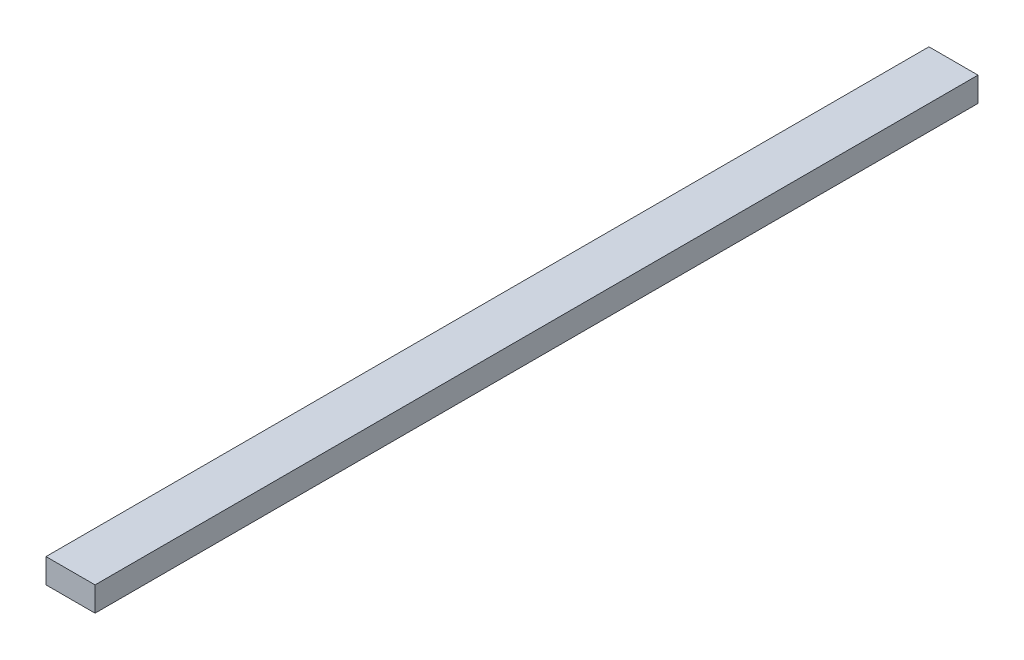
ISO-10303-21;
HEADER;
FILE_DESCRIPTION(('STEP AP214'),'2;1');
FILE_NAME('part.step','',(''),(''),'','','');
FILE_SCHEMA(('AUTOMOTIVE_DESIGN { 1 0 10303 214 1 1 1 1 }'));
ENDSEC;
DATA;
#1=APPLICATION_CONTEXT('core data for automotive mechanical design processes');
#2=APPLICATION_PROTOCOL_DEFINITION('international standard','automotive_design',2000,#1);
#3=PRODUCT_CONTEXT('',#1,'mechanical');
#4=PRODUCT('Part','Part','',(#3));
#5=PRODUCT_RELATED_PRODUCT_CATEGORY('part','',(#4));
#6=PRODUCT_DEFINITION_FORMATION('','',#4);
#7=PRODUCT_DEFINITION_CONTEXT('part definition',#1,'design');
#8=PRODUCT_DEFINITION('design','',#6,#7);
#9=PRODUCT_DEFINITION_SHAPE('','',#8);
#10=(LENGTH_UNIT() NAMED_UNIT(*) SI_UNIT(.MILLI.,.METRE.));
#11=(NAMED_UNIT(*) PLANE_ANGLE_UNIT() SI_UNIT($,.RADIAN.));
#12=(NAMED_UNIT(*) SI_UNIT($,.STERADIAN.) SOLID_ANGLE_UNIT());
#13=UNCERTAINTY_MEASURE_WITH_UNIT(LENGTH_MEASURE(1.E-05),#10,'distance_accuracy_value','');
#14=(GEOMETRIC_REPRESENTATION_CONTEXT(3) GLOBAL_UNCERTAINTY_ASSIGNED_CONTEXT((#13)) GLOBAL_UNIT_ASSIGNED_CONTEXT((#10,
#11,#12)) REPRESENTATION_CONTEXT('',''));
#15=CARTESIAN_POINT('',(0.,0.,0.));
#16=DIRECTION('',(0.,0.,1.));
#17=DIRECTION('',(1.,0.,0.));
#18=AXIS2_PLACEMENT_3D('',#15,#16,#17);
#19=CARTESIAN_POINT('',(0.,0.,1828.8));
#20=DIRECTION('',(1.,0.,0.));
#21=DIRECTION('',(0.,0.,-1.));
#22=AXIS2_PLACEMENT_3D('',#19,#20,#21);
#23=PLANE('',#22);
#24=DIRECTION('',(0.,-1.,0.));
#25=VECTOR('',#24,1.);
#26=CARTESIAN_POINT('',(0.,0.,0.));
#27=LINE('',#26,#25);
#28=CARTESIAN_POINT('',(0.,50.8,0.));
#29=VERTEX_POINT('',#28);
#30=CARTESIAN_POINT('',(0.,0.,0.));
#31=VERTEX_POINT('',#30);
#32=EDGE_CURVE('E95',#29,#31,#27,.T.);
#33=ORIENTED_EDGE('',*,*,#32,.T.);
#34=DIRECTION('',(0.,0.,-1.));
#35=VECTOR('',#34,1.);
#36=CARTESIAN_POINT('',(0.,0.,1828.8));
#37=LINE('',#36,#35);
#38=CARTESIAN_POINT('',(0.,0.,1828.8));
#39=VERTEX_POINT('',#38);
#40=EDGE_CURVE('E11',#39,#31,#37,.T.);
#41=ORIENTED_EDGE('',*,*,#40,.F.);
#42=DIRECTION('',(0.,-1.,0.));
#43=VECTOR('',#42,1.);
#44=CARTESIAN_POINT('',(0.,0.,1828.8));
#45=LINE('',#44,#43);
#46=CARTESIAN_POINT('',(0.,50.8,1828.8));
#47=VERTEX_POINT('',#46);
#48=EDGE_CURVE('E83',#47,#39,#45,.T.);
#49=ORIENTED_EDGE('',*,*,#48,.F.);
#50=DIRECTION('',(0.,0.,-1.));
#51=VECTOR('',#50,1.);
#52=CARTESIAN_POINT('',(0.,50.8,1828.8));
#53=LINE('',#52,#51);
#54=EDGE_CURVE('E91',#47,#29,#53,.T.);
#55=ORIENTED_EDGE('',*,*,#54,.T.);
#56=EDGE_LOOP('',(#33,#41,#49,#55));
#57=FACE_BOUND('',#56,.T.);
#58=ADVANCED_FACE('F32',(#57),#23,.F.);
#59=CARTESIAN_POINT('',(0.,0.,1828.8));
#60=DIRECTION('',(0.,1.,0.));
#61=DIRECTION('',(0.,0.,1.));
#62=AXIS2_PLACEMENT_3D('',#59,#60,#61);
#63=PLANE('',#62);
#64=DIRECTION('',(1.,0.,0.));
#65=VECTOR('',#64,1.);
#66=CARTESIAN_POINT('',(0.,0.,0.));
#67=LINE('',#66,#65);
#68=CARTESIAN_POINT('',(101.6,0.,0.));
#69=VERTEX_POINT('',#68);
#70=EDGE_CURVE('E87',#31,#69,#67,.T.);
#71=ORIENTED_EDGE('',*,*,#70,.T.);
#72=DIRECTION('',(0.,0.,-1.));
#73=VECTOR('',#72,1.);
#74=CARTESIAN_POINT('',(101.6,0.,1828.8));
#75=LINE('',#74,#73);
#76=CARTESIAN_POINT('',(101.6,0.,1828.8));
#77=VERTEX_POINT('',#76);
#78=EDGE_CURVE('E40',#77,#69,#75,.T.);
#79=ORIENTED_EDGE('',*,*,#78,.F.);
#80=DIRECTION('',(1.,0.,0.));
#81=VECTOR('',#80,1.);
#82=CARTESIAN_POINT('',(0.,0.,1828.8));
#83=LINE('',#82,#81);
#84=EDGE_CURVE('E78',#39,#77,#83,.T.);
#85=ORIENTED_EDGE('',*,*,#84,.F.);
#86=ORIENTED_EDGE('',*,*,#40,.T.);
#87=EDGE_LOOP('',(#71,#79,#85,#86));
#88=FACE_BOUND('',#87,.T.);
#89=ADVANCED_FACE('F86',(#88),#63,.F.);
#90=CARTESIAN_POINT('',(101.6,0.,1828.8));
#91=DIRECTION('',(-1.,0.,0.));
#92=DIRECTION('',(0.,0.,1.));
#93=AXIS2_PLACEMENT_3D('',#90,#91,#92);
#94=PLANE('',#93);
#95=DIRECTION('',(0.,1.,0.));
#96=VECTOR('',#95,1.);
#97=CARTESIAN_POINT('',(101.6,0.,0.));
#98=LINE('',#97,#96);
#99=CARTESIAN_POINT('',(101.6,50.8,0.));
#100=VERTEX_POINT('',#99);
#101=EDGE_CURVE('E65',#69,#100,#98,.T.);
#102=ORIENTED_EDGE('',*,*,#101,.T.);
#103=DIRECTION('',(0.,0.,-1.));
#104=VECTOR('',#103,1.);
#105=CARTESIAN_POINT('',(101.6,50.8,1828.8));
#106=LINE('',#105,#104);
#107=CARTESIAN_POINT('',(101.6,50.8,1828.8));
#108=VERTEX_POINT('',#107);
#109=EDGE_CURVE('E88',#108,#100,#106,.T.);
#110=ORIENTED_EDGE('',*,*,#109,.F.);
#111=DIRECTION('',(0.,1.,0.));
#112=VECTOR('',#111,1.);
#113=CARTESIAN_POINT('',(101.6,0.,1828.8));
#114=LINE('',#113,#112);
#115=EDGE_CURVE('E81',#77,#108,#114,.T.);
#116=ORIENTED_EDGE('',*,*,#115,.F.);
#117=ORIENTED_EDGE('',*,*,#78,.T.);
#118=EDGE_LOOP('',(#102,#110,#116,#117));
#119=FACE_BOUND('',#118,.T.);
#120=ADVANCED_FACE('F89',(#119),#94,.F.);
#121=CARTESIAN_POINT('',(0.,50.8,1828.8));
#122=DIRECTION('',(0.,-1.,0.));
#123=DIRECTION('',(0.,0.,-1.));
#124=AXIS2_PLACEMENT_3D('',#121,#122,#123);
#125=PLANE('',#124);
#126=DIRECTION('',(-1.,0.,0.));
#127=VECTOR('',#126,1.);
#128=CARTESIAN_POINT('',(0.,50.8,0.));
#129=LINE('',#128,#127);
#130=EDGE_CURVE('E71',#100,#29,#129,.T.);
#131=ORIENTED_EDGE('',*,*,#130,.T.);
#132=ORIENTED_EDGE('',*,*,#54,.F.);
#133=DIRECTION('',(-1.,0.,0.));
#134=VECTOR('',#133,1.);
#135=CARTESIAN_POINT('',(0.,50.8,1828.8));
#136=LINE('',#135,#134);
#137=EDGE_CURVE('E48',#108,#47,#136,.T.);
#138=ORIENTED_EDGE('',*,*,#137,.F.);
#139=ORIENTED_EDGE('',*,*,#109,.T.);
#140=EDGE_LOOP('',(#131,#132,#138,#139));
#141=FACE_BOUND('',#140,.T.);
#142=ADVANCED_FACE('F102',(#141),#125,.F.);
#143=CARTESIAN_POINT('',(0.,0.,1828.8));
#144=DIRECTION('',(0.,0.,-1.));
#145=DIRECTION('',(-1.,0.,0.));
#146=AXIS2_PLACEMENT_3D('',#143,#144,#145);
#147=PLANE('',#146);
#148=ORIENTED_EDGE('',*,*,#48,.T.);
#149=ORIENTED_EDGE('',*,*,#84,.T.);
#150=ORIENTED_EDGE('',*,*,#115,.T.);
#151=ORIENTED_EDGE('',*,*,#137,.T.);
#152=EDGE_LOOP('',(#148,#149,#150,#151));
#153=FACE_BOUND('',#152,.T.);
#154=ADVANCED_FACE('F79',(#153),#147,.F.);
#155=CARTESIAN_POINT('',(0.,0.,0.));
#156=DIRECTION('',(0.,0.,-1.));
#157=DIRECTION('',(-1.,0.,0.));
#158=AXIS2_PLACEMENT_3D('',#155,#156,#157);
#159=PLANE('',#158);
#160=ORIENTED_EDGE('',*,*,#32,.F.);
#161=ORIENTED_EDGE('',*,*,#130,.F.);
#162=ORIENTED_EDGE('',*,*,#101,.F.);
#163=ORIENTED_EDGE('',*,*,#70,.F.);
#164=EDGE_LOOP('',(#160,#161,#162,#163));
#165=FACE_BOUND('',#164,.T.);
#166=ADVANCED_FACE('F105',(#165),#159,.T.);
#167=CLOSED_SHELL('',(#58,#89,#120,#142,#154,#166));
#168=MANIFOLD_SOLID_BREP('B2',#167);
#169=ADVANCED_BREP_SHAPE_REPRESENTATION('',(#18,#168),#14);
#170=SHAPE_DEFINITION_REPRESENTATION(#9,#169);
ENDSEC;
END-ISO-10303-21;
